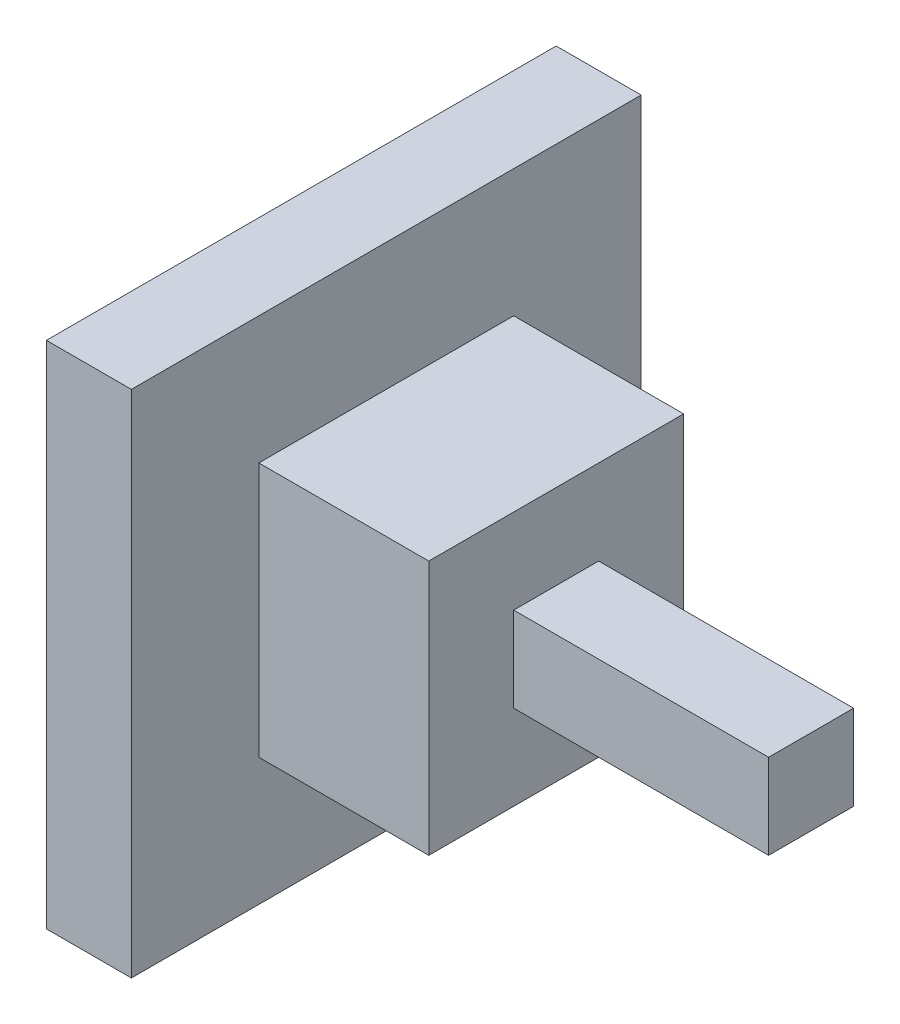
ISO-10303-21;
HEADER;
FILE_DESCRIPTION(('STEP AP214'),'2;1');
FILE_NAME('part.step','',(''),(''),'','','');
FILE_SCHEMA(('AUTOMOTIVE_DESIGN { 1 0 10303 214 1 1 1 1 }'));
ENDSEC;
DATA;
#1=APPLICATION_CONTEXT('core data for automotive mechanical design processes');
#2=APPLICATION_PROTOCOL_DEFINITION('international standard','automotive_design',2000,#1);
#3=PRODUCT_CONTEXT('',#1,'mechanical');
#4=PRODUCT('Part','Part','',(#3));
#5=PRODUCT_RELATED_PRODUCT_CATEGORY('part','',(#4));
#6=PRODUCT_DEFINITION_FORMATION('','',#4);
#7=PRODUCT_DEFINITION_CONTEXT('part definition',#1,'design');
#8=PRODUCT_DEFINITION('design','',#6,#7);
#9=PRODUCT_DEFINITION_SHAPE('','',#8);
#10=(LENGTH_UNIT() NAMED_UNIT(*) SI_UNIT(.MILLI.,.METRE.));
#11=(NAMED_UNIT(*) PLANE_ANGLE_UNIT() SI_UNIT($,.RADIAN.));
#12=(NAMED_UNIT(*) SI_UNIT($,.STERADIAN.) SOLID_ANGLE_UNIT());
#13=UNCERTAINTY_MEASURE_WITH_UNIT(LENGTH_MEASURE(1.E-05),#10,'distance_accuracy_value','');
#14=(GEOMETRIC_REPRESENTATION_CONTEXT(3) GLOBAL_UNCERTAINTY_ASSIGNED_CONTEXT((#13)) GLOBAL_UNIT_ASSIGNED_CONTEXT((#10,
#11,#12)) REPRESENTATION_CONTEXT('',''));
#15=CARTESIAN_POINT('',(0.,0.,0.));
#16=DIRECTION('',(0.,0.,1.));
#17=DIRECTION('',(1.,0.,0.));
#18=AXIS2_PLACEMENT_3D('',#15,#16,#17);
#19=CARTESIAN_POINT('',(25.4,0.,0.));
#20=DIRECTION('',(1.,0.,0.));
#21=DIRECTION('',(0.,0.,-1.));
#22=AXIS2_PLACEMENT_3D('',#19,#20,#21);
#23=PLANE('',#22);
#24=DIRECTION('',(0.,0.,-1.));
#25=VECTOR('',#24,1.);
#26=CARTESIAN_POINT('',(25.4,-76.2,76.2));
#27=LINE('',#26,#25);
#28=CARTESIAN_POINT('',(25.4,-76.2,76.2));
#29=VERTEX_POINT('',#28);
#30=CARTESIAN_POINT('',(25.4,-76.2,-76.2));
#31=VERTEX_POINT('',#30);
#32=EDGE_CURVE('E182',#29,#31,#27,.T.);
#33=ORIENTED_EDGE('',*,*,#32,.T.);
#34=DIRECTION('',(0.,1.,0.));
#35=VECTOR('',#34,1.);
#36=CARTESIAN_POINT('',(25.4,-76.2,-76.2));
#37=LINE('',#36,#35);
#38=CARTESIAN_POINT('',(25.4,76.2,-76.2));
#39=VERTEX_POINT('',#38);
#40=EDGE_CURVE('E185',#31,#39,#37,.T.);
#41=ORIENTED_EDGE('',*,*,#40,.T.);
#42=DIRECTION('',(0.,0.,-1.));
#43=VECTOR('',#42,1.);
#44=CARTESIAN_POINT('',(25.4,76.2,76.2));
#45=LINE('',#44,#43);
#46=CARTESIAN_POINT('',(25.4,76.2,76.2));
#47=VERTEX_POINT('',#46);
#48=EDGE_CURVE('E188',#47,#39,#45,.T.);
#49=ORIENTED_EDGE('',*,*,#48,.F.);
#50=DIRECTION('',(0.,1.,0.));
#51=VECTOR('',#50,1.);
#52=CARTESIAN_POINT('',(25.4,-76.2,76.2));
#53=LINE('',#52,#51);
#54=EDGE_CURVE('E191',#29,#47,#53,.T.);
#55=ORIENTED_EDGE('',*,*,#54,.F.);
#56=EDGE_LOOP('',(#33,#41,#49,#55));
#57=FACE_BOUND('',#56,.T.);
#58=DIRECTION('',(0.,-1.,0.));
#59=VECTOR('',#58,1.);
#60=CARTESIAN_POINT('',(25.4,0.,-38.1));
#61=LINE('',#60,#59);
#62=CARTESIAN_POINT('',(25.4,38.1,-38.1));
#63=VERTEX_POINT('',#62);
#64=CARTESIAN_POINT('',(25.4,-38.1,-38.1));
#65=VERTEX_POINT('',#64);
#66=EDGE_CURVE('E177',#63,#65,#61,.T.);
#67=ORIENTED_EDGE('',*,*,#66,.T.);
#68=DIRECTION('',(0.,0.,1.));
#69=VECTOR('',#68,1.);
#70=CARTESIAN_POINT('',(25.4,-38.1,0.));
#71=LINE('',#70,#69);
#72=CARTESIAN_POINT('',(25.4,-38.1,38.1));
#73=VERTEX_POINT('',#72);
#74=EDGE_CURVE('E179',#65,#73,#71,.T.);
#75=ORIENTED_EDGE('',*,*,#74,.T.);
#76=DIRECTION('',(0.,-1.,0.));
#77=VECTOR('',#76,1.);
#78=CARTESIAN_POINT('',(25.4,0.,38.1));
#79=LINE('',#78,#77);
#80=CARTESIAN_POINT('',(25.4,38.1,38.1));
#81=VERTEX_POINT('',#80);
#82=EDGE_CURVE('E171',#81,#73,#79,.T.);
#83=ORIENTED_EDGE('',*,*,#82,.F.);
#84=DIRECTION('',(0.,0.,1.));
#85=VECTOR('',#84,1.);
#86=CARTESIAN_POINT('',(25.4,38.1,0.));
#87=LINE('',#86,#85);
#88=EDGE_CURVE('E174',#63,#81,#87,.T.);
#89=ORIENTED_EDGE('',*,*,#88,.F.);
#90=EDGE_LOOP('',(#67,#75,#83,#89));
#91=FACE_BOUND('',#90,.T.);
#92=ADVANCED_FACE('F35',(#57,#91),#23,.T.);
#93=CARTESIAN_POINT('',(25.4,-76.2,76.2));
#94=DIRECTION('',(0.,1.,0.));
#95=DIRECTION('',(0.,0.,1.));
#96=AXIS2_PLACEMENT_3D('',#93,#94,#95);
#97=PLANE('',#96);
#98=DIRECTION('',(0.,0.,-1.));
#99=VECTOR('',#98,1.);
#100=CARTESIAN_POINT('',(0.,-76.2,76.2));
#101=LINE('',#100,#99);
#102=CARTESIAN_POINT('',(0.,-76.2,76.2));
#103=VERTEX_POINT('',#102);
#104=CARTESIAN_POINT('',(0.,-76.2,-76.2));
#105=VERTEX_POINT('',#104);
#106=EDGE_CURVE('E181',#103,#105,#101,.T.);
#107=ORIENTED_EDGE('',*,*,#106,.T.);
#108=DIRECTION('',(-1.,0.,0.));
#109=VECTOR('',#108,1.);
#110=CARTESIAN_POINT('',(25.4,-76.2,-76.2));
#111=LINE('',#110,#109);
#112=EDGE_CURVE('E210',#31,#105,#111,.T.);
#113=ORIENTED_EDGE('',*,*,#112,.F.);
#114=ORIENTED_EDGE('',*,*,#32,.F.);
#115=DIRECTION('',(-1.,0.,0.));
#116=VECTOR('',#115,1.);
#117=CARTESIAN_POINT('',(25.4,-76.2,76.2));
#118=LINE('',#117,#116);
#119=EDGE_CURVE('E194',#29,#103,#118,.T.);
#120=ORIENTED_EDGE('',*,*,#119,.T.);
#121=EDGE_LOOP('',(#107,#113,#114,#120));
#122=FACE_BOUND('',#121,.T.);
#123=ADVANCED_FACE('F232',(#122),#97,.F.);
#124=CARTESIAN_POINT('',(25.4,-76.2,-76.2));
#125=DIRECTION('',(0.,0.,1.));
#126=DIRECTION('',(1.,0.,0.));
#127=AXIS2_PLACEMENT_3D('',#124,#125,#126);
#128=PLANE('',#127);
#129=DIRECTION('',(0.,1.,0.));
#130=VECTOR('',#129,1.);
#131=CARTESIAN_POINT('',(0.,-76.2,-76.2));
#132=LINE('',#131,#130);
#133=CARTESIAN_POINT('',(0.,76.2,-76.2));
#134=VERTEX_POINT('',#133);
#135=EDGE_CURVE('E197',#105,#134,#132,.T.);
#136=ORIENTED_EDGE('',*,*,#135,.T.);
#137=DIRECTION('',(-1.,0.,0.));
#138=VECTOR('',#137,1.);
#139=CARTESIAN_POINT('',(25.4,76.2,-76.2));
#140=LINE('',#139,#138);
#141=EDGE_CURVE('E208',#39,#134,#140,.T.);
#142=ORIENTED_EDGE('',*,*,#141,.F.);
#143=ORIENTED_EDGE('',*,*,#40,.F.);
#144=ORIENTED_EDGE('',*,*,#112,.T.);
#145=EDGE_LOOP('',(#136,#142,#143,#144));
#146=FACE_BOUND('',#145,.T.);
#147=ADVANCED_FACE('F238',(#146),#128,.F.);
#148=CARTESIAN_POINT('',(25.4,76.2,76.2));
#149=DIRECTION('',(0.,1.,0.));
#150=DIRECTION('',(0.,0.,1.));
#151=AXIS2_PLACEMENT_3D('',#148,#149,#150);
#152=PLANE('',#151);
#153=DIRECTION('',(0.,0.,-1.));
#154=VECTOR('',#153,1.);
#155=CARTESIAN_POINT('',(0.,76.2,76.2));
#156=LINE('',#155,#154);
#157=CARTESIAN_POINT('',(0.,76.2,76.2));
#158=VERTEX_POINT('',#157);
#159=EDGE_CURVE('E200',#158,#134,#156,.T.);
#160=ORIENTED_EDGE('',*,*,#159,.F.);
#161=DIRECTION('',(-1.,0.,0.));
#162=VECTOR('',#161,1.);
#163=CARTESIAN_POINT('',(25.4,76.2,76.2));
#164=LINE('',#163,#162);
#165=EDGE_CURVE('E206',#47,#158,#164,.T.);
#166=ORIENTED_EDGE('',*,*,#165,.F.);
#167=ORIENTED_EDGE('',*,*,#48,.T.);
#168=ORIENTED_EDGE('',*,*,#141,.T.);
#169=EDGE_LOOP('',(#160,#166,#167,#168));
#170=FACE_BOUND('',#169,.T.);
#171=ADVANCED_FACE('F250',(#170),#152,.T.);
#172=CARTESIAN_POINT('',(25.4,-76.2,76.2));
#173=DIRECTION('',(0.,0.,1.));
#174=DIRECTION('',(1.,0.,0.));
#175=AXIS2_PLACEMENT_3D('',#172,#173,#174);
#176=PLANE('',#175);
#177=DIRECTION('',(0.,1.,0.));
#178=VECTOR('',#177,1.);
#179=CARTESIAN_POINT('',(0.,-76.2,76.2));
#180=LINE('',#179,#178);
#181=EDGE_CURVE('E186',#103,#158,#180,.T.);
#182=ORIENTED_EDGE('',*,*,#181,.F.);
#183=ORIENTED_EDGE('',*,*,#119,.F.);
#184=ORIENTED_EDGE('',*,*,#54,.T.);
#185=ORIENTED_EDGE('',*,*,#165,.T.);
#186=EDGE_LOOP('',(#182,#183,#184,#185));
#187=FACE_BOUND('',#186,.T.);
#188=ADVANCED_FACE('F246',(#187),#176,.T.);
#189=CARTESIAN_POINT('',(0.,0.,0.));
#190=DIRECTION('',(1.,0.,0.));
#191=DIRECTION('',(0.,0.,-1.));
#192=AXIS2_PLACEMENT_3D('',#189,#190,#191);
#193=PLANE('',#192);
#194=ORIENTED_EDGE('',*,*,#106,.F.);
#195=ORIENTED_EDGE('',*,*,#181,.T.);
#196=ORIENTED_EDGE('',*,*,#159,.T.);
#197=ORIENTED_EDGE('',*,*,#135,.F.);
#198=EDGE_LOOP('',(#194,#195,#196,#197));
#199=FACE_BOUND('',#198,.T.);
#200=ADVANCED_FACE('F249',(#199),#193,.F.);
#201=CARTESIAN_POINT('',(76.2,-38.1,0.));
#202=DIRECTION('',(0.,1.,0.));
#203=DIRECTION('',(0.,0.,1.));
#204=AXIS2_PLACEMENT_3D('',#201,#202,#203);
#205=PLANE('',#204);
#206=ORIENTED_EDGE('',*,*,#74,.F.);
#207=DIRECTION('',(-1.,0.,0.));
#208=VECTOR('',#207,1.);
#209=CARTESIAN_POINT('',(76.2,-38.1,-38.1));
#210=LINE('',#209,#208);
#211=CARTESIAN_POINT('',(76.2,-38.1,-38.1));
#212=VERTEX_POINT('',#211);
#213=EDGE_CURVE('E168',#212,#65,#210,.T.);
#214=ORIENTED_EDGE('',*,*,#213,.F.);
#215=DIRECTION('',(0.,0.,-1.));
#216=VECTOR('',#215,1.);
#217=CARTESIAN_POINT('',(76.2,-38.1,0.));
#218=LINE('',#217,#216);
#219=CARTESIAN_POINT('',(76.2,-38.1,38.1));
#220=VERTEX_POINT('',#219);
#221=EDGE_CURVE('E141',#220,#212,#218,.T.);
#222=ORIENTED_EDGE('',*,*,#221,.F.);
#223=DIRECTION('',(-1.,0.,0.));
#224=VECTOR('',#223,1.);
#225=CARTESIAN_POINT('',(76.2,-38.1,38.1));
#226=LINE('',#225,#224);
#227=EDGE_CURVE('E159',#220,#73,#226,.T.);
#228=ORIENTED_EDGE('',*,*,#227,.T.);
#229=EDGE_LOOP('',(#206,#214,#222,#228));
#230=FACE_BOUND('',#229,.T.);
#231=ADVANCED_FACE('F244',(#230),#205,.F.);
#232=CARTESIAN_POINT('',(76.2,0.,-38.1));
#233=DIRECTION('',(0.,0.,1.));
#234=DIRECTION('',(1.,0.,0.));
#235=AXIS2_PLACEMENT_3D('',#232,#233,#234);
#236=PLANE('',#235);
#237=ORIENTED_EDGE('',*,*,#66,.F.);
#238=DIRECTION('',(-1.,0.,0.));
#239=VECTOR('',#238,1.);
#240=CARTESIAN_POINT('',(76.2,38.1,-38.1));
#241=LINE('',#240,#239);
#242=CARTESIAN_POINT('',(76.2,38.1,-38.1));
#243=VERTEX_POINT('',#242);
#244=EDGE_CURVE('E165',#243,#63,#241,.T.);
#245=ORIENTED_EDGE('',*,*,#244,.F.);
#246=DIRECTION('',(0.,1.,0.));
#247=VECTOR('',#246,1.);
#248=CARTESIAN_POINT('',(76.2,0.,-38.1));
#249=LINE('',#248,#247);
#250=EDGE_CURVE('E151',#212,#243,#249,.T.);
#251=ORIENTED_EDGE('',*,*,#250,.F.);
#252=ORIENTED_EDGE('',*,*,#213,.T.);
#253=EDGE_LOOP('',(#237,#245,#251,#252));
#254=FACE_BOUND('',#253,.T.);
#255=ADVANCED_FACE('F308',(#254),#236,.F.);
#256=CARTESIAN_POINT('',(76.2,38.1,0.));
#257=DIRECTION('',(0.,1.,0.));
#258=DIRECTION('',(0.,0.,1.));
#259=AXIS2_PLACEMENT_3D('',#256,#257,#258);
#260=PLANE('',#259);
#261=ORIENTED_EDGE('',*,*,#244,.T.);
#262=ORIENTED_EDGE('',*,*,#88,.T.);
#263=DIRECTION('',(-1.,0.,0.));
#264=VECTOR('',#263,1.);
#265=CARTESIAN_POINT('',(76.2,38.1,38.1));
#266=LINE('',#265,#264);
#267=CARTESIAN_POINT('',(76.2,38.1,38.1));
#268=VERTEX_POINT('',#267);
#269=EDGE_CURVE('E162',#268,#81,#266,.T.);
#270=ORIENTED_EDGE('',*,*,#269,.F.);
#271=DIRECTION('',(0.,0.,-1.));
#272=VECTOR('',#271,1.);
#273=CARTESIAN_POINT('',(76.2,38.1,0.));
#274=LINE('',#273,#272);
#275=EDGE_CURVE('E153',#268,#243,#274,.T.);
#276=ORIENTED_EDGE('',*,*,#275,.T.);
#277=EDGE_LOOP('',(#261,#262,#270,#276));
#278=FACE_BOUND('',#277,.T.);
#279=ADVANCED_FACE('F316',(#278),#260,.T.);
#280=CARTESIAN_POINT('',(76.2,0.,38.1));
#281=DIRECTION('',(0.,0.,1.));
#282=DIRECTION('',(1.,0.,0.));
#283=AXIS2_PLACEMENT_3D('',#280,#281,#282);
#284=PLANE('',#283);
#285=ORIENTED_EDGE('',*,*,#269,.T.);
#286=ORIENTED_EDGE('',*,*,#82,.T.);
#287=ORIENTED_EDGE('',*,*,#227,.F.);
#288=DIRECTION('',(0.,1.,0.));
#289=VECTOR('',#288,1.);
#290=CARTESIAN_POINT('',(76.2,0.,38.1));
#291=LINE('',#290,#289);
#292=EDGE_CURVE('E156',#220,#268,#291,.T.);
#293=ORIENTED_EDGE('',*,*,#292,.T.);
#294=EDGE_LOOP('',(#285,#286,#287,#293));
#295=FACE_BOUND('',#294,.T.);
#296=ADVANCED_FACE('F324',(#295),#284,.T.);
#297=CARTESIAN_POINT('',(76.2,0.,0.));
#298=DIRECTION('',(1.,0.,0.));
#299=DIRECTION('',(0.,0.,-1.));
#300=AXIS2_PLACEMENT_3D('',#297,#298,#299);
#301=PLANE('',#300);
#302=DIRECTION('',(0.,1.,0.));
#303=VECTOR('',#302,1.);
#304=CARTESIAN_POINT('',(76.2,0.,-12.7));
#305=LINE('',#304,#303);
#306=CARTESIAN_POINT('',(76.2,-12.7,-12.7));
#307=VERTEX_POINT('',#306);
#308=CARTESIAN_POINT('',(76.2,12.7,-12.7));
#309=VERTEX_POINT('',#308);
#310=EDGE_CURVE('E56',#307,#309,#305,.T.);
#311=ORIENTED_EDGE('',*,*,#310,.F.);
#312=DIRECTION('',(0.,0.,-1.));
#313=VECTOR('',#312,1.);
#314=CARTESIAN_POINT('',(76.2,-12.7,0.));
#315=LINE('',#314,#313);
#316=CARTESIAN_POINT('',(76.2,-12.7,12.7));
#317=VERTEX_POINT('',#316);
#318=EDGE_CURVE('E50',#317,#307,#315,.T.);
#319=ORIENTED_EDGE('',*,*,#318,.F.);
#320=DIRECTION('',(0.,1.,0.));
#321=VECTOR('',#320,1.);
#322=CARTESIAN_POINT('',(76.2,0.,12.7));
#323=LINE('',#322,#321);
#324=CARTESIAN_POINT('',(76.2,12.7,12.7));
#325=VERTEX_POINT('',#324);
#326=EDGE_CURVE('E129',#317,#325,#323,.T.);
#327=ORIENTED_EDGE('',*,*,#326,.T.);
#328=DIRECTION('',(0.,0.,-1.));
#329=VECTOR('',#328,1.);
#330=CARTESIAN_POINT('',(76.2,12.7,0.));
#331=LINE('',#330,#329);
#332=EDGE_CURVE('E138',#325,#309,#331,.T.);
#333=ORIENTED_EDGE('',*,*,#332,.T.);
#334=EDGE_LOOP('',(#311,#319,#327,#333));
#335=FACE_BOUND('',#334,.T.);
#336=ORIENTED_EDGE('',*,*,#221,.T.);
#337=ORIENTED_EDGE('',*,*,#250,.T.);
#338=ORIENTED_EDGE('',*,*,#275,.F.);
#339=ORIENTED_EDGE('',*,*,#292,.F.);
#340=EDGE_LOOP('',(#336,#337,#338,#339));
#341=FACE_BOUND('',#340,.T.);
#342=ADVANCED_FACE('F143',(#335,#341),#301,.T.);
#343=CARTESIAN_POINT('',(152.4,0.,0.));
#344=DIRECTION('',(1.,0.,0.));
#345=DIRECTION('',(0.,0.,-1.));
#346=AXIS2_PLACEMENT_3D('',#343,#344,#345);
#347=PLANE('',#346);
#348=DIRECTION('',(0.,0.,-1.));
#349=VECTOR('',#348,1.);
#350=CARTESIAN_POINT('',(152.4,-12.7,0.));
#351=LINE('',#350,#349);
#352=CARTESIAN_POINT('',(152.4,-12.7,12.7));
#353=VERTEX_POINT('',#352);
#354=CARTESIAN_POINT('',(152.4,-12.7,-12.7));
#355=VERTEX_POINT('',#354);
#356=EDGE_CURVE('E213',#353,#355,#351,.T.);
#357=ORIENTED_EDGE('',*,*,#356,.T.);
#358=DIRECTION('',(0.,1.,0.));
#359=VECTOR('',#358,1.);
#360=CARTESIAN_POINT('',(152.4,0.,-12.7));
#361=LINE('',#360,#359);
#362=CARTESIAN_POINT('',(152.4,12.7,-12.7));
#363=VERTEX_POINT('',#362);
#364=EDGE_CURVE('E216',#355,#363,#361,.T.);
#365=ORIENTED_EDGE('',*,*,#364,.T.);
#366=DIRECTION('',(0.,0.,-1.));
#367=VECTOR('',#366,1.);
#368=CARTESIAN_POINT('',(152.4,12.7,0.));
#369=LINE('',#368,#367);
#370=CARTESIAN_POINT('',(152.4,12.7,12.7));
#371=VERTEX_POINT('',#370);
#372=EDGE_CURVE('E218',#371,#363,#369,.T.);
#373=ORIENTED_EDGE('',*,*,#372,.F.);
#374=DIRECTION('',(0.,1.,0.));
#375=VECTOR('',#374,1.);
#376=CARTESIAN_POINT('',(152.4,0.,12.7));
#377=LINE('',#376,#375);
#378=EDGE_CURVE('E131',#353,#371,#377,.T.);
#379=ORIENTED_EDGE('',*,*,#378,.F.);
#380=EDGE_LOOP('',(#357,#365,#373,#379));
#381=FACE_BOUND('',#380,.T.);
#382=ADVANCED_FACE('F223',(#381),#347,.T.);
#383=CARTESIAN_POINT('',(152.4,0.,12.7));
#384=DIRECTION('',(0.,0.,1.));
#385=DIRECTION('',(1.,0.,0.));
#386=AXIS2_PLACEMENT_3D('',#383,#384,#385);
#387=PLANE('',#386);
#388=ORIENTED_EDGE('',*,*,#326,.F.);
#389=DIRECTION('',(-1.,0.,0.));
#390=VECTOR('',#389,1.);
#391=CARTESIAN_POINT('',(152.4,-12.7,12.7));
#392=LINE('',#391,#390);
#393=EDGE_CURVE('E135',#353,#317,#392,.T.);
#394=ORIENTED_EDGE('',*,*,#393,.F.);
#395=ORIENTED_EDGE('',*,*,#378,.T.);
#396=DIRECTION('',(-1.,0.,0.));
#397=VECTOR('',#396,1.);
#398=CARTESIAN_POINT('',(152.4,12.7,12.7));
#399=LINE('',#398,#397);
#400=EDGE_CURVE('E125',#371,#325,#399,.T.);
#401=ORIENTED_EDGE('',*,*,#400,.T.);
#402=EDGE_LOOP('',(#388,#394,#395,#401));
#403=FACE_BOUND('',#402,.T.);
#404=ADVANCED_FACE('F127',(#403),#387,.T.);
#405=CARTESIAN_POINT('',(152.4,12.7,0.));
#406=DIRECTION('',(0.,1.,0.));
#407=DIRECTION('',(0.,0.,1.));
#408=AXIS2_PLACEMENT_3D('',#405,#406,#407);
#409=PLANE('',#408);
#410=ORIENTED_EDGE('',*,*,#332,.F.);
#411=ORIENTED_EDGE('',*,*,#400,.F.);
#412=ORIENTED_EDGE('',*,*,#372,.T.);
#413=DIRECTION('',(-1.,0.,0.));
#414=VECTOR('',#413,1.);
#415=CARTESIAN_POINT('',(152.4,12.7,-12.7));
#416=LINE('',#415,#414);
#417=EDGE_CURVE('E43',#363,#309,#416,.T.);
#418=ORIENTED_EDGE('',*,*,#417,.T.);
#419=EDGE_LOOP('',(#410,#411,#412,#418));
#420=FACE_BOUND('',#419,.T.);
#421=ADVANCED_FACE('F139',(#420),#409,.T.);
#422=CARTESIAN_POINT('',(152.4,0.,-12.7));
#423=DIRECTION('',(0.,0.,1.));
#424=DIRECTION('',(1.,0.,0.));
#425=AXIS2_PLACEMENT_3D('',#422,#423,#424);
#426=PLANE('',#425);
#427=DIRECTION('',(-1.,0.,0.));
#428=VECTOR('',#427,1.);
#429=CARTESIAN_POINT('',(152.4,-12.7,-12.7));
#430=LINE('',#429,#428);
#431=EDGE_CURVE('E11',#355,#307,#430,.T.);
#432=ORIENTED_EDGE('',*,*,#431,.T.);
#433=ORIENTED_EDGE('',*,*,#310,.T.);
#434=ORIENTED_EDGE('',*,*,#417,.F.);
#435=ORIENTED_EDGE('',*,*,#364,.F.);
#436=EDGE_LOOP('',(#432,#433,#434,#435));
#437=FACE_BOUND('',#436,.T.);
#438=ADVANCED_FACE('F224',(#437),#426,.F.);
#439=CARTESIAN_POINT('',(152.4,-12.7,0.));
#440=DIRECTION('',(0.,1.,0.));
#441=DIRECTION('',(0.,0.,1.));
#442=AXIS2_PLACEMENT_3D('',#439,#440,#441);
#443=PLANE('',#442);
#444=ORIENTED_EDGE('',*,*,#393,.T.);
#445=ORIENTED_EDGE('',*,*,#318,.T.);
#446=ORIENTED_EDGE('',*,*,#431,.F.);
#447=ORIENTED_EDGE('',*,*,#356,.F.);
#448=EDGE_LOOP('',(#444,#445,#446,#447));
#449=FACE_BOUND('',#448,.T.);
#450=ADVANCED_FACE('F37',(#449),#443,.F.);
#451=CLOSED_SHELL('',(#92,#123,#147,#171,#188,#200,#231,#255,#279,#296,#342,#382,#404,#421,#438,#450));
#452=MANIFOLD_SOLID_BREP('B2',#451);
#453=ADVANCED_BREP_SHAPE_REPRESENTATION('',(#18,#452),#14);
#454=SHAPE_DEFINITION_REPRESENTATION(#9,#453);
ENDSEC;
END-ISO-10303-21;
